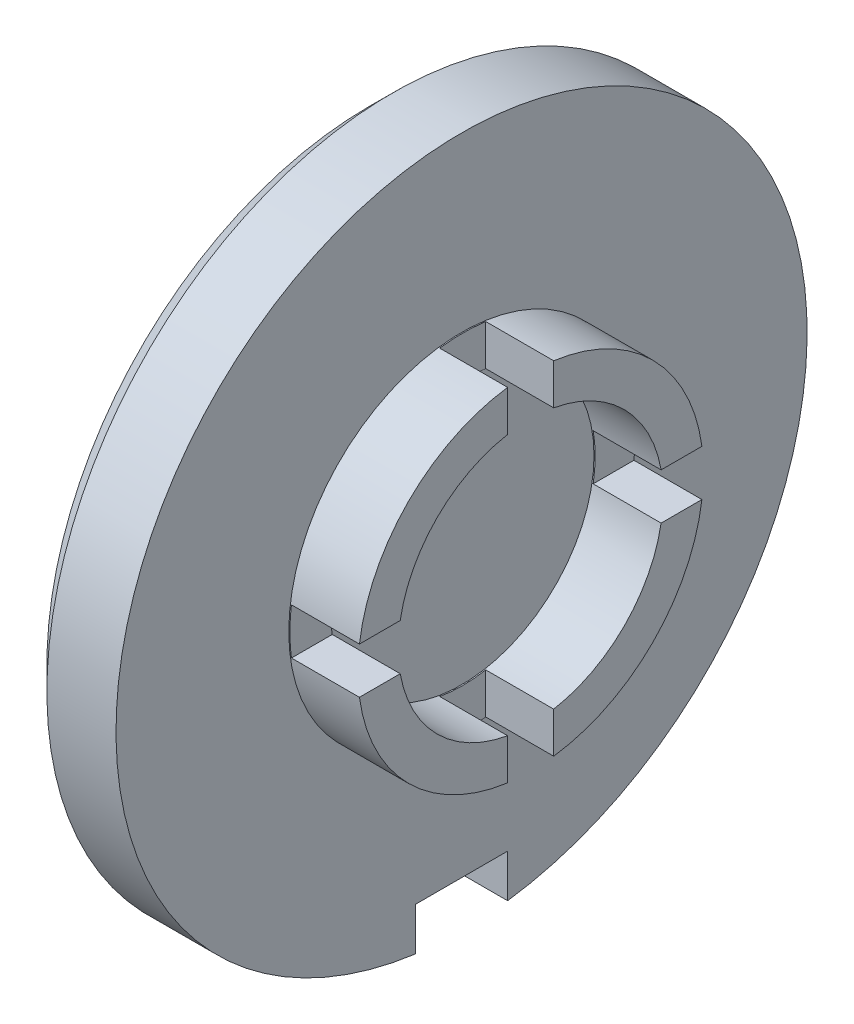
ISO-10303-21;
HEADER;
FILE_DESCRIPTION(('STEP AP214'),'2;1');
FILE_NAME('part.step','',(''),(''),'','','');
FILE_SCHEMA(('AUTOMOTIVE_DESIGN { 1 0 10303 214 1 1 1 1 }'));
ENDSEC;
DATA;
#1=APPLICATION_CONTEXT('core data for automotive mechanical design processes');
#2=APPLICATION_PROTOCOL_DEFINITION('international standard','automotive_design',2000,#1);
#3=PRODUCT_CONTEXT('',#1,'mechanical');
#4=PRODUCT('Part','Part','',(#3));
#5=PRODUCT_RELATED_PRODUCT_CATEGORY('part','',(#4));
#6=PRODUCT_DEFINITION_FORMATION('','',#4);
#7=PRODUCT_DEFINITION_CONTEXT('part definition',#1,'design');
#8=PRODUCT_DEFINITION('design','',#6,#7);
#9=PRODUCT_DEFINITION_SHAPE('','',#8);
#10=(LENGTH_UNIT() NAMED_UNIT(*) SI_UNIT(.MILLI.,.METRE.));
#11=(NAMED_UNIT(*) PLANE_ANGLE_UNIT() SI_UNIT($,.RADIAN.));
#12=(NAMED_UNIT(*) SI_UNIT($,.STERADIAN.) SOLID_ANGLE_UNIT());
#13=UNCERTAINTY_MEASURE_WITH_UNIT(LENGTH_MEASURE(1.E-05),#10,'distance_accuracy_value','');
#14=(GEOMETRIC_REPRESENTATION_CONTEXT(3) GLOBAL_UNCERTAINTY_ASSIGNED_CONTEXT((#13)) GLOBAL_UNIT_ASSIGNED_CONTEXT((#10,
#11,#12)) REPRESENTATION_CONTEXT('',''));
#15=CARTESIAN_POINT('',(0.,0.,0.));
#16=DIRECTION('',(0.,0.,1.));
#17=DIRECTION('',(1.,0.,0.));
#18=AXIS2_PLACEMENT_3D('',#15,#16,#17);
#19=CARTESIAN_POINT('',(-76.8,-20.,-52.));
#20=DIRECTION('',(1.,0.,0.));
#21=DIRECTION('',(0.,0.,-1.));
#22=AXIS2_PLACEMENT_3D('',#19,#20,#21);
#23=PLANE('',#22);
#24=DIRECTION('',(0.,1.,0.));
#25=VECTOR('',#24,1.);
#26=CARTESIAN_POINT('',(-76.8,-20.,-51.2));
#27=LINE('',#26,#25);
#28=CARTESIAN_POINT('',(-76.8,-25.5425625842204,-51.2));
#29=VERTEX_POINT('',#28);
#30=CARTESIAN_POINT('',(-76.8,-25.2,-51.2));
#31=VERTEX_POINT('',#30);
#32=EDGE_CURVE('E359',#29,#31,#27,.T.);
#33=ORIENTED_EDGE('',*,*,#32,.F.);
#34=CARTESIAN_POINT('',(-76.8,-20.,-52.));
#35=DIRECTION('',(-1.,0.,0.));
#36=DIRECTION('',(0.,0.,1.));
#37=AXIS2_PLACEMENT_3D('',#34,#35,#36);
#38=CIRCLE('',#37,5.6);
#39=CARTESIAN_POINT('',(-76.8,-25.5425625842204,-52.8));
#40=VERTEX_POINT('',#39);
#41=EDGE_CURVE('E260',#29,#40,#38,.T.);
#42=ORIENTED_EDGE('',*,*,#41,.T.);
#43=DIRECTION('',(0.,1.,0.));
#44=VECTOR('',#43,1.);
#45=CARTESIAN_POINT('',(-76.8,-20.,-52.8));
#46=LINE('',#45,#44);
#47=CARTESIAN_POINT('',(-76.8,-25.2,-52.8));
#48=VERTEX_POINT('',#47);
#49=EDGE_CURVE('E395',#40,#48,#46,.T.);
#50=ORIENTED_EDGE('',*,*,#49,.T.);
#51=DIRECTION('',(0.,0.,-1.));
#52=VECTOR('',#51,1.);
#53=CARTESIAN_POINT('',(-76.8,-25.2,-52.));
#54=LINE('',#53,#52);
#55=EDGE_CURVE('E205',#31,#48,#54,.T.);
#56=ORIENTED_EDGE('',*,*,#55,.F.);
#57=EDGE_LOOP('',(#33,#42,#50,#56));
#58=FACE_BOUND('',#57,.T.);
#59=ADVANCED_FACE('F47',(#58),#23,.F.);
#60=CARTESIAN_POINT('',(-76.4,-20.,-52.));
#61=DIRECTION('',(1.,0.,0.));
#62=DIRECTION('',(0.,0.,-1.));
#63=AXIS2_PLACEMENT_3D('',#60,#61,#62);
#64=CONICAL_SURFACE('',#63,6.,0.78539816339747);
#65=CARTESIAN_POINT('',(-75.5053728090001,-26.8480569582091,-51.2));
#66=CARTESIAN_POINT('',(-75.6881030317566,-26.6640807466869,-51.2));
#67=CARTESIAN_POINT('',(-75.8707866928955,-26.480058250433,-51.2));
#68=CARTESIAN_POINT('',(-76.2360245862569,-26.1118852017641,-51.2));
#69=CARTESIAN_POINT('',(-76.418578818597,-25.9277346494659,-51.2));
#70=CARTESIAN_POINT('',(-76.7835219670777,-25.5592695807787,-51.2));
#71=CARTESIAN_POINT('',(-76.9659108831408,-25.374955064313,-51.2));
#72=CARTESIAN_POINT('',(-77.3304582431577,-25.0060979425621,-51.2));
#73=CARTESIAN_POINT('',(-77.5126166868986,-24.8215553370668,-51.2));
#74=CARTESIAN_POINT('',(-77.6946271909999,-24.6368667515551,-51.2));
#75=B_SPLINE_CURVE_WITH_KNOTS('',3,(#65,#66,#67,#68,#69,#70,#71,#72,#73,#74),.UNSPECIFIED.,.F.,
.F.,(4,2,2,2,4),(0.,0.777906337908829,1.55581196755155,2.33371796179654,3.11162467374078),.UNSPECIFIED.);
#76=CARTESIAN_POINT('',(-76.4,-25.9464274989274,-51.2));
#77=VERTEX_POINT('',#76);
#78=EDGE_CURVE('E362',#77,#29,#75,.T.);
#79=ORIENTED_EDGE('',*,*,#78,.F.);
#80=CARTESIAN_POINT('',(-76.4,-20.,-52.));
#81=DIRECTION('',(-1.,0.,0.));
#82=DIRECTION('',(0.,0.,1.));
#83=AXIS2_PLACEMENT_3D('',#80,#81,#82);
#84=CIRCLE('',#83,6.);
#85=CARTESIAN_POINT('',(-76.4,-25.9464274989274,-52.8));
#86=VERTEX_POINT('',#85);
#87=EDGE_CURVE('E264',#77,#86,#84,.T.);
#88=ORIENTED_EDGE('',*,*,#87,.T.);
#89=CARTESIAN_POINT('',(-75.5053728090001,-26.8480569582091,-52.8));
#90=CARTESIAN_POINT('',(-75.6881030317566,-26.6640807466869,-52.8));
#91=CARTESIAN_POINT('',(-75.8707866928955,-26.480058250433,-52.8));
#92=CARTESIAN_POINT('',(-76.2360245862569,-26.1118852017641,-52.8));
#93=CARTESIAN_POINT('',(-76.418578818597,-25.9277346494659,-52.8));
#94=CARTESIAN_POINT('',(-76.7835219670777,-25.5592695807787,-52.8));
#95=CARTESIAN_POINT('',(-76.9659108831408,-25.374955064313,-52.8));
#96=CARTESIAN_POINT('',(-77.3304582431577,-25.0060979425621,-52.8));
#97=CARTESIAN_POINT('',(-77.5126166868986,-24.8215553370668,-52.8));
#98=CARTESIAN_POINT('',(-77.6946271909999,-24.6368667515551,-52.8));
#99=B_SPLINE_CURVE_WITH_KNOTS('',3,(#89,#90,#91,#92,#93,#94,#95,#96,#97,#98),.UNSPECIFIED.,.F.,
.F.,(4,2,2,2,4),(0.,0.777906337908829,1.55581196755155,2.33371796179654,3.11162467374078),.UNSPECIFIED.);
#100=EDGE_CURVE('E387',#86,#40,#99,.T.);
#101=ORIENTED_EDGE('',*,*,#100,.T.);
#102=ORIENTED_EDGE('',*,*,#41,.F.);
#103=EDGE_LOOP('',(#79,#88,#101,#102));
#104=FACE_BOUND('',#103,.T.);
#105=ADVANCED_FACE('F373',(#104),#64,.T.);
#106=CARTESIAN_POINT('',(-81.8,-20.,-52.));
#107=DIRECTION('',(-1.,0.,0.));
#108=DIRECTION('',(0.,0.,1.));
#109=AXIS2_PLACEMENT_3D('',#106,#107,#108);
#110=CYLINDRICAL_SURFACE('',#109,6.);
#111=DIRECTION('',(-1.,0.,0.));
#112=VECTOR('',#111,1.);
#113=CARTESIAN_POINT('',(-81.8,-25.9464274989274,-51.2));
#114=LINE('',#113,#112);
#115=CARTESIAN_POINT('',(-75.2,-25.9464274989274,-51.2));
#116=VERTEX_POINT('',#115);
#117=EDGE_CURVE('E371',#116,#77,#114,.T.);
#118=ORIENTED_EDGE('',*,*,#117,.F.);
#119=CARTESIAN_POINT('',(-75.2,-20.,-52.));
#120=DIRECTION('',(-1.,0.,0.));
#121=DIRECTION('',(0.,0.,1.));
#122=AXIS2_PLACEMENT_3D('',#119,#120,#121);
#123=CIRCLE('',#122,6.);
#124=CARTESIAN_POINT('',(-75.2,-25.9464274989274,-52.8));
#125=VERTEX_POINT('',#124);
#126=EDGE_CURVE('E268',#116,#125,#123,.T.);
#127=ORIENTED_EDGE('',*,*,#126,.T.);
#128=DIRECTION('',(-1.,0.,0.));
#129=VECTOR('',#128,1.);
#130=CARTESIAN_POINT('',(-81.8,-25.9464274989274,-52.8));
#131=LINE('',#130,#129);
#132=EDGE_CURVE('E63',#125,#86,#131,.T.);
#133=ORIENTED_EDGE('',*,*,#132,.T.);
#134=ORIENTED_EDGE('',*,*,#87,.F.);
#135=EDGE_LOOP('',(#118,#127,#133,#134));
#136=FACE_BOUND('',#135,.T.);
#137=ADVANCED_FACE('F406',(#136),#110,.T.);
#138=CARTESIAN_POINT('',(-75.2,-14.,-52.));
#139=DIRECTION('',(-1.,0.,0.));
#140=DIRECTION('',(0.,0.,1.));
#141=AXIS2_PLACEMENT_3D('',#138,#139,#140);
#142=PLANE('',#141);
#143=CARTESIAN_POINT('',(-75.2,-20.,-52.));
#144=DIRECTION('',(-1.,0.,0.));
#145=DIRECTION('',(0.,0.,1.));
#146=AXIS2_PLACEMENT_3D('',#143,#144,#145);
#147=CIRCLE('',#146,3.);
#148=CARTESIAN_POINT('',(-75.2,-20.,-49.));
#149=VERTEX_POINT('',#148);
#150=EDGE_CURVE('E271',#149,#149,#147,.T.);
#151=ORIENTED_EDGE('',*,*,#150,.T.);
#152=EDGE_LOOP('',(#151));
#153=FACE_BOUND('',#152,.T.);
#154=DIRECTION('',(0.,-1.,0.));
#155=VECTOR('',#154,1.);
#156=CARTESIAN_POINT('',(-75.2,-14.,-51.2));
#157=LINE('',#156,#155);
#158=CARTESIAN_POINT('',(-75.2,-25.2,-51.2));
#159=VERTEX_POINT('',#158);
#160=EDGE_CURVE('E11',#159,#116,#157,.T.);
#161=ORIENTED_EDGE('',*,*,#160,.F.);
#162=DIRECTION('',(0.,0.,1.));
#163=VECTOR('',#162,1.);
#164=CARTESIAN_POINT('',(-75.2,-25.2,-52.));
#165=LINE('',#164,#163);
#166=CARTESIAN_POINT('',(-75.2,-25.2,-52.8));
#167=VERTEX_POINT('',#166);
#168=EDGE_CURVE('E56',#167,#159,#165,.T.);
#169=ORIENTED_EDGE('',*,*,#168,.F.);
#170=DIRECTION('',(0.,-1.,0.));
#171=VECTOR('',#170,1.);
#172=CARTESIAN_POINT('',(-75.2,-14.,-52.8));
#173=LINE('',#172,#171);
#174=EDGE_CURVE('E188',#167,#125,#173,.T.);
#175=ORIENTED_EDGE('',*,*,#174,.T.);
#176=ORIENTED_EDGE('',*,*,#126,.F.);
#177=EDGE_LOOP('',(#161,#169,#175,#176));
#178=FACE_BOUND('',#177,.T.);
#179=ADVANCED_FACE('F210',(#153,#178),#142,.F.);
#180=CARTESIAN_POINT('',(-74.,-17.,-52.));
#181=DIRECTION('',(-1.,0.,0.));
#182=DIRECTION('',(0.,0.,1.));
#183=AXIS2_PLACEMENT_3D('',#180,#181,#182);
#184=PLANE('',#183);
#185=DIRECTION('',(0.,-1.,0.));
#186=VECTOR('',#185,1.);
#187=CARTESIAN_POINT('',(-74.,-17.,-51.6));
#188=LINE('',#187,#186);
#189=CARTESIAN_POINT('',(-74.,-22.2649503305812,-51.6));
#190=VERTEX_POINT('',#189);
#191=CARTESIAN_POINT('',(-74.,-22.9732137494637,-51.6));
#192=VERTEX_POINT('',#191);
#193=EDGE_CURVE('E324',#190,#192,#188,.T.);
#194=ORIENTED_EDGE('',*,*,#193,.F.);
#195=CARTESIAN_POINT('',(-74.,-20.,-52.));
#196=DIRECTION('',(-1.,0.,0.));
#197=DIRECTION('',(0.,0.,1.));
#198=AXIS2_PLACEMENT_3D('',#195,#196,#197);
#199=CIRCLE('',#198,2.3);
#200=CARTESIAN_POINT('',(-74.,-20.4,-49.7350496694188));
#201=VERTEX_POINT('',#200);
#202=EDGE_CURVE('E259',#190,#201,#199,.T.);
#203=ORIENTED_EDGE('',*,*,#202,.T.);
#204=DIRECTION('',(0.,0.,-1.));
#205=VECTOR('',#204,1.);
#206=CARTESIAN_POINT('',(-74.,-20.4,-52.));
#207=LINE('',#206,#205);
#208=CARTESIAN_POINT('',(-74.,-20.4,-49.0267862505363));
#209=VERTEX_POINT('',#208);
#210=EDGE_CURVE('E293',#209,#201,#207,.T.);
#211=ORIENTED_EDGE('',*,*,#210,.F.);
#212=CARTESIAN_POINT('',(-74.,-20.,-52.));
#213=DIRECTION('',(-1.,0.,0.));
#214=DIRECTION('',(0.,0.,1.));
#215=AXIS2_PLACEMENT_3D('',#212,#213,#214);
#216=CIRCLE('',#215,3.);
#217=EDGE_CURVE('E280',#192,#209,#216,.T.);
#218=ORIENTED_EDGE('',*,*,#217,.F.);
#219=EDGE_LOOP('',(#194,#203,#211,#218));
#220=FACE_BOUND('',#219,.T.);
#221=ADVANCED_FACE('F431',(#220),#184,.F.);
#222=DIRECTION('',(0.,-1.,0.));
#223=VECTOR('',#222,1.);
#224=CARTESIAN_POINT('',(-74.,-17.,-51.6));
#225=LINE('',#224,#223);
#226=CARTESIAN_POINT('',(-74.,-17.0267862505363,-51.6));
#227=VERTEX_POINT('',#226);
#228=CARTESIAN_POINT('',(-74.,-17.7350496694188,-51.6));
#229=VERTEX_POINT('',#228);
#230=EDGE_CURVE('E330',#227,#229,#225,.T.);
#231=ORIENTED_EDGE('',*,*,#230,.F.);
#232=CARTESIAN_POINT('',(-74.,-19.6,-49.0267862505363));
#233=VERTEX_POINT('',#232);
#234=EDGE_CURVE('E275',#233,#227,#216,.T.);
#235=ORIENTED_EDGE('',*,*,#234,.F.);
#236=DIRECTION('',(0.,0.,1.));
#237=VECTOR('',#236,1.);
#238=CARTESIAN_POINT('',(-74.,-19.6,-52.));
#239=LINE('',#238,#237);
#240=CARTESIAN_POINT('',(-74.,-19.6,-49.7350496694188));
#241=VERTEX_POINT('',#240);
#242=EDGE_CURVE('E300',#241,#233,#239,.T.);
#243=ORIENTED_EDGE('',*,*,#242,.F.);
#244=EDGE_CURVE('E249',#241,#229,#199,.T.);
#245=ORIENTED_EDGE('',*,*,#244,.T.);
#246=EDGE_LOOP('',(#231,#235,#243,#245));
#247=FACE_BOUND('',#246,.T.);
#248=ADVANCED_FACE('F423',(#247),#184,.F.);
#249=CARTESIAN_POINT('',(-81.8,-20.,-52.));
#250=DIRECTION('',(-1.,0.,0.));
#251=DIRECTION('',(0.,0.,1.));
#252=AXIS2_PLACEMENT_3D('',#249,#250,#251);
#253=CYLINDRICAL_SURFACE('',#252,2.3);
#254=CARTESIAN_POINT('',(-75.2,-20.,-52.));
#255=DIRECTION('',(-1.,0.,0.));
#256=DIRECTION('',(0.,0.,1.));
#257=AXIS2_PLACEMENT_3D('',#254,#255,#256);
#258=CIRCLE('',#257,2.3);
#259=CARTESIAN_POINT('',(-75.2,-20.,-49.7));
#260=VERTEX_POINT('',#259);
#261=EDGE_CURVE('E255',#260,#260,#258,.T.);
#262=ORIENTED_EDGE('',*,*,#261,.T.);
#263=EDGE_LOOP('',(#262));
#264=FACE_BOUND('',#263,.T.);
#265=DIRECTION('',(-1.,0.,0.));
#266=VECTOR('',#265,1.);
#267=CARTESIAN_POINT('',(-81.8,-22.2649503305812,-51.6));
#268=LINE('',#267,#266);
#269=CARTESIAN_POINT('',(-75.18,-22.2649503305812,-51.6));
#270=VERTEX_POINT('',#269);
#271=EDGE_CURVE('E321',#270,#190,#268,.F.);
#272=ORIENTED_EDGE('',*,*,#271,.F.);
#273=CARTESIAN_POINT('',(-75.18,-20.,-52.));
#274=DIRECTION('',(1.,0.,0.));
#275=DIRECTION('',(0.,0.,-1.));
#276=AXIS2_PLACEMENT_3D('',#273,#274,#275);
#277=CIRCLE('',#276,2.3);
#278=CARTESIAN_POINT('',(-75.18,-22.2649503305812,-52.4));
#279=VERTEX_POINT('',#278);
#280=EDGE_CURVE('E317',#279,#270,#277,.F.);
#281=ORIENTED_EDGE('',*,*,#280,.F.);
#282=DIRECTION('',(-1.,0.,0.));
#283=VECTOR('',#282,1.);
#284=CARTESIAN_POINT('',(-81.8,-22.2649503305812,-52.4));
#285=LINE('',#284,#283);
#286=CARTESIAN_POINT('',(-74.,-22.2649503305812,-52.4));
#287=VERTEX_POINT('',#286);
#288=EDGE_CURVE('E333',#279,#287,#285,.F.);
#289=ORIENTED_EDGE('',*,*,#288,.T.);
#290=CARTESIAN_POINT('',(-74.,-20.4,-54.2649503305812));
#291=VERTEX_POINT('',#290);
#292=EDGE_CURVE('E254',#291,#287,#199,.T.);
#293=ORIENTED_EDGE('',*,*,#292,.F.);
#294=DIRECTION('',(-1.,0.,0.));
#295=VECTOR('',#294,1.);
#296=CARTESIAN_POINT('',(-81.8,-20.4,-54.2649503305812));
#297=LINE('',#296,#295);
#298=CARTESIAN_POINT('',(-75.18,-20.4,-54.2649503305812));
#299=VERTEX_POINT('',#298);
#300=EDGE_CURVE('E286',#299,#291,#297,.F.);
#301=ORIENTED_EDGE('',*,*,#300,.F.);
#302=CARTESIAN_POINT('',(-75.18,-20.,-52.));
#303=DIRECTION('',(1.,0.,0.));
#304=DIRECTION('',(0.,0.,-1.));
#305=AXIS2_PLACEMENT_3D('',#302,#303,#304);
#306=CIRCLE('',#305,2.3);
#307=CARTESIAN_POINT('',(-75.18,-19.6,-54.2649503305812));
#308=VERTEX_POINT('',#307);
#309=EDGE_CURVE('E282',#308,#299,#306,.F.);
#310=ORIENTED_EDGE('',*,*,#309,.F.);
#311=DIRECTION('',(-1.,0.,0.));
#312=VECTOR('',#311,1.);
#313=CARTESIAN_POINT('',(-81.8,-19.6,-54.2649503305812));
#314=LINE('',#313,#312);
#315=CARTESIAN_POINT('',(-74.,-19.6,-54.2649503305812));
#316=VERTEX_POINT('',#315);
#317=EDGE_CURVE('E301',#316,#308,#314,.T.);
#318=ORIENTED_EDGE('',*,*,#317,.F.);
#319=CARTESIAN_POINT('',(-74.,-17.7350496694188,-52.4));
#320=VERTEX_POINT('',#319);
#321=EDGE_CURVE('E253',#320,#316,#199,.T.);
#322=ORIENTED_EDGE('',*,*,#321,.F.);
#323=DIRECTION('',(-1.,0.,0.));
#324=VECTOR('',#323,1.);
#325=CARTESIAN_POINT('',(-81.8,-17.7350496694188,-52.4));
#326=LINE('',#325,#324);
#327=CARTESIAN_POINT('',(-75.18,-17.7350496694188,-52.4));
#328=VERTEX_POINT('',#327);
#329=EDGE_CURVE('E341',#320,#328,#326,.T.);
#330=ORIENTED_EDGE('',*,*,#329,.T.);
#331=CARTESIAN_POINT('',(-75.18,-17.7350496694188,-51.6));
#332=VERTEX_POINT('',#331);
#333=EDGE_CURVE('E318',#332,#328,#277,.F.);
#334=ORIENTED_EDGE('',*,*,#333,.F.);
#335=DIRECTION('',(-1.,0.,0.));
#336=VECTOR('',#335,1.);
#337=CARTESIAN_POINT('',(-81.8,-17.7350496694188,-51.6));
#338=LINE('',#337,#336);
#339=EDGE_CURVE('E327',#229,#332,#338,.T.);
#340=ORIENTED_EDGE('',*,*,#339,.F.);
#341=ORIENTED_EDGE('',*,*,#244,.F.);
#342=DIRECTION('',(-1.,0.,0.));
#343=VECTOR('',#342,1.);
#344=CARTESIAN_POINT('',(-81.8,-19.6,-49.7350496694188));
#345=LINE('',#344,#343);
#346=CARTESIAN_POINT('',(-75.18,-19.6,-49.7350496694188));
#347=VERTEX_POINT('',#346);
#348=EDGE_CURVE('E297',#347,#241,#345,.F.);
#349=ORIENTED_EDGE('',*,*,#348,.F.);
#350=CARTESIAN_POINT('',(-75.18,-20.4,-49.7350496694188));
#351=VERTEX_POINT('',#350);
#352=EDGE_CURVE('E285',#351,#347,#306,.F.);
#353=ORIENTED_EDGE('',*,*,#352,.F.);
#354=DIRECTION('',(-1.,0.,0.));
#355=VECTOR('',#354,1.);
#356=CARTESIAN_POINT('',(-81.8,-20.4,-49.7350496694188));
#357=LINE('',#356,#355);
#358=EDGE_CURVE('E290',#201,#351,#357,.T.);
#359=ORIENTED_EDGE('',*,*,#358,.F.);
#360=ORIENTED_EDGE('',*,*,#202,.F.);
#361=EDGE_LOOP('',(#272,#281,#289,#293,#301,#310,#318,#322,#330,#334,#340,#341,#349,#353,#359,#360));
#362=FACE_BOUND('',#361,.T.);
#363=ADVANCED_FACE('F420',(#264,#362),#253,.F.);
#364=CARTESIAN_POINT('',(-81.8,-20.,-52.));
#365=DIRECTION('',(-1.,0.,0.));
#366=DIRECTION('',(0.,0.,1.));
#367=AXIS2_PLACEMENT_3D('',#364,#365,#366);
#368=CYLINDRICAL_SURFACE('',#367,3.);
#369=ORIENTED_EDGE('',*,*,#150,.F.);
#370=EDGE_LOOP('',(#369));
#371=FACE_BOUND('',#370,.T.);
#372=DIRECTION('',(-1.,0.,0.));
#373=VECTOR('',#372,1.);
#374=CARTESIAN_POINT('',(-81.8,-22.9732137494637,-51.6));
#375=LINE('',#374,#373);
#376=CARTESIAN_POINT('',(-75.18,-22.9732137494637,-51.6));
#377=VERTEX_POINT('',#376);
#378=EDGE_CURVE('E198',#192,#377,#375,.T.);
#379=ORIENTED_EDGE('',*,*,#378,.F.);
#380=ORIENTED_EDGE('',*,*,#217,.T.);
#381=DIRECTION('',(-1.,0.,0.));
#382=VECTOR('',#381,1.);
#383=CARTESIAN_POINT('',(-81.8,-20.4,-49.0267862505363));
#384=LINE('',#383,#382);
#385=CARTESIAN_POINT('',(-75.18,-20.4,-49.0267862505363));
#386=VERTEX_POINT('',#385);
#387=EDGE_CURVE('E230',#386,#209,#384,.F.);
#388=ORIENTED_EDGE('',*,*,#387,.F.);
#389=CARTESIAN_POINT('',(-75.18,-20.,-52.));
#390=DIRECTION('',(1.,0.,0.));
#391=DIRECTION('',(0.,0.,-1.));
#392=AXIS2_PLACEMENT_3D('',#389,#390,#391);
#393=CIRCLE('',#392,3.);
#394=CARTESIAN_POINT('',(-75.18,-19.6,-49.0267862505363));
#395=VERTEX_POINT('',#394);
#396=EDGE_CURVE('E234',#395,#386,#393,.T.);
#397=ORIENTED_EDGE('',*,*,#396,.F.);
#398=DIRECTION('',(-1.,0.,0.));
#399=VECTOR('',#398,1.);
#400=CARTESIAN_POINT('',(-81.8,-19.6,-49.0267862505363));
#401=LINE('',#400,#399);
#402=EDGE_CURVE('E235',#233,#395,#401,.T.);
#403=ORIENTED_EDGE('',*,*,#402,.F.);
#404=ORIENTED_EDGE('',*,*,#234,.T.);
#405=DIRECTION('',(-1.,0.,0.));
#406=VECTOR('',#405,1.);
#407=CARTESIAN_POINT('',(-81.8,-17.0267862505363,-51.6));
#408=LINE('',#407,#406);
#409=CARTESIAN_POINT('',(-75.18,-17.0267862505363,-51.6));
#410=VERTEX_POINT('',#409);
#411=EDGE_CURVE('E220',#410,#227,#408,.F.);
#412=ORIENTED_EDGE('',*,*,#411,.F.);
#413=CARTESIAN_POINT('',(-75.18,-20.,-52.));
#414=DIRECTION('',(1.,0.,0.));
#415=DIRECTION('',(0.,0.,-1.));
#416=AXIS2_PLACEMENT_3D('',#413,#414,#415);
#417=CIRCLE('',#416,3.);
#418=CARTESIAN_POINT('',(-75.18,-17.0267862505363,-52.4));
#419=VERTEX_POINT('',#418);
#420=EDGE_CURVE('E223',#419,#410,#417,.T.);
#421=ORIENTED_EDGE('',*,*,#420,.F.);
#422=DIRECTION('',(-1.,0.,0.));
#423=VECTOR('',#422,1.);
#424=CARTESIAN_POINT('',(-81.8,-17.0267862505363,-52.4));
#425=LINE('',#424,#423);
#426=CARTESIAN_POINT('',(-74.,-17.0267862505363,-52.4));
#427=VERTEX_POINT('',#426);
#428=EDGE_CURVE('E226',#419,#427,#425,.F.);
#429=ORIENTED_EDGE('',*,*,#428,.T.);
#430=CARTESIAN_POINT('',(-74.,-19.6,-54.9732137494637));
#431=VERTEX_POINT('',#430);
#432=EDGE_CURVE('E279',#427,#431,#216,.T.);
#433=ORIENTED_EDGE('',*,*,#432,.T.);
#434=DIRECTION('',(-1.,0.,0.));
#435=VECTOR('',#434,1.);
#436=CARTESIAN_POINT('',(-81.8,-19.6,-54.9732137494637));
#437=LINE('',#436,#435);
#438=CARTESIAN_POINT('',(-75.18,-19.6,-54.9732137494637));
#439=VERTEX_POINT('',#438);
#440=EDGE_CURVE('E245',#439,#431,#437,.F.);
#441=ORIENTED_EDGE('',*,*,#440,.F.);
#442=CARTESIAN_POINT('',(-75.18,-20.4,-54.9732137494637));
#443=VERTEX_POINT('',#442);
#444=EDGE_CURVE('E241',#443,#439,#393,.T.);
#445=ORIENTED_EDGE('',*,*,#444,.F.);
#446=DIRECTION('',(-1.,0.,0.));
#447=VECTOR('',#446,1.);
#448=CARTESIAN_POINT('',(-81.8,-20.4,-54.9732137494637));
#449=LINE('',#448,#447);
#450=CARTESIAN_POINT('',(-74.,-20.4,-54.9732137494637));
#451=VERTEX_POINT('',#450);
#452=EDGE_CURVE('E238',#451,#443,#449,.T.);
#453=ORIENTED_EDGE('',*,*,#452,.F.);
#454=CARTESIAN_POINT('',(-74.,-22.9732137494637,-52.4));
#455=VERTEX_POINT('',#454);
#456=EDGE_CURVE('E281',#451,#455,#216,.T.);
#457=ORIENTED_EDGE('',*,*,#456,.T.);
#458=DIRECTION('',(-1.,0.,0.));
#459=VECTOR('',#458,1.);
#460=CARTESIAN_POINT('',(-81.8,-22.9732137494637,-52.4));
#461=LINE('',#460,#459);
#462=CARTESIAN_POINT('',(-75.18,-22.9732137494637,-52.4));
#463=VERTEX_POINT('',#462);
#464=EDGE_CURVE('E216',#455,#463,#461,.T.);
#465=ORIENTED_EDGE('',*,*,#464,.T.);
#466=EDGE_CURVE('E215',#377,#463,#417,.T.);
#467=ORIENTED_EDGE('',*,*,#466,.F.);
#468=EDGE_LOOP('',(#379,#380,#388,#397,#403,#404,#412,#421,#429,#433,#441,#445,#453,#457,#465,#467));
#469=FACE_BOUND('',#468,.T.);
#470=ADVANCED_FACE('F422',(#371,#469),#368,.T.);
#471=ORIENTED_EDGE('',*,*,#292,.T.);
#472=DIRECTION('',(0.,-1.,0.));
#473=VECTOR('',#472,1.);
#474=CARTESIAN_POINT('',(-74.,-17.,-52.4));
#475=LINE('',#474,#473);
#476=EDGE_CURVE('E337',#287,#455,#475,.T.);
#477=ORIENTED_EDGE('',*,*,#476,.T.);
#478=ORIENTED_EDGE('',*,*,#456,.F.);
#479=EDGE_CURVE('E289',#291,#451,#207,.T.);
#480=ORIENTED_EDGE('',*,*,#479,.F.);
#481=EDGE_LOOP('',(#471,#477,#478,#480));
#482=FACE_BOUND('',#481,.T.);
#483=ADVANCED_FACE('F49',(#482),#184,.F.);
#484=ORIENTED_EDGE('',*,*,#432,.F.);
#485=DIRECTION('',(0.,-1.,0.));
#486=VECTOR('',#485,1.);
#487=CARTESIAN_POINT('',(-74.,-17.,-52.4));
#488=LINE('',#487,#486);
#489=EDGE_CURVE('E345',#427,#320,#488,.T.);
#490=ORIENTED_EDGE('',*,*,#489,.T.);
#491=ORIENTED_EDGE('',*,*,#321,.T.);
#492=EDGE_CURVE('E304',#431,#316,#239,.T.);
#493=ORIENTED_EDGE('',*,*,#492,.F.);
#494=EDGE_LOOP('',(#484,#490,#491,#493));
#495=FACE_BOUND('',#494,.T.);
#496=ADVANCED_FACE('F418',(#495),#184,.F.);
#497=CARTESIAN_POINT('',(-75.2,-17.7,-52.));
#498=DIRECTION('',(-1.,0.,0.));
#499=DIRECTION('',(0.,0.,1.));
#500=AXIS2_PLACEMENT_3D('',#497,#498,#499);
#501=PLANE('',#500);
#502=ORIENTED_EDGE('',*,*,#261,.F.);
#503=EDGE_LOOP('',(#502));
#504=FACE_BOUND('',#503,.T.);
#505=ADVANCED_FACE('F415',(#504),#501,.F.);
#506=CARTESIAN_POINT('',(-75.18,-20.4,-48.8));
#507=DIRECTION('',(0.,1.,0.));
#508=DIRECTION('',(0.,0.,1.));
#509=AXIS2_PLACEMENT_3D('',#506,#507,#508);
#510=PLANE('',#509);
#511=ORIENTED_EDGE('',*,*,#300,.T.);
#512=ORIENTED_EDGE('',*,*,#479,.T.);
#513=ORIENTED_EDGE('',*,*,#452,.T.);
#514=DIRECTION('',(0.,0.,-1.));
#515=VECTOR('',#514,1.);
#516=CARTESIAN_POINT('',(-75.18,-20.4,-48.8));
#517=LINE('',#516,#515);
#518=EDGE_CURVE('E309',#299,#443,#517,.T.);
#519=ORIENTED_EDGE('',*,*,#518,.F.);
#520=EDGE_LOOP('',(#511,#512,#513,#519));
#521=FACE_BOUND('',#520,.T.);
#522=ADVANCED_FACE('F417',(#521),#510,.T.);
#523=CARTESIAN_POINT('',(-75.18,-19.6,-48.8));
#524=DIRECTION('',(0.,-1.,0.));
#525=DIRECTION('',(0.,0.,-1.));
#526=AXIS2_PLACEMENT_3D('',#523,#524,#525);
#527=PLANE('',#526);
#528=ORIENTED_EDGE('',*,*,#317,.T.);
#529=DIRECTION('',(0.,0.,-1.));
#530=VECTOR('',#529,1.);
#531=CARTESIAN_POINT('',(-75.18,-19.6,-48.8));
#532=LINE('',#531,#530);
#533=EDGE_CURVE('E314',#308,#439,#532,.T.);
#534=ORIENTED_EDGE('',*,*,#533,.T.);
#535=ORIENTED_EDGE('',*,*,#440,.T.);
#536=ORIENTED_EDGE('',*,*,#492,.T.);
#537=EDGE_LOOP('',(#528,#534,#535,#536));
#538=FACE_BOUND('',#537,.T.);
#539=ADVANCED_FACE('F461',(#538),#527,.T.);
#540=CARTESIAN_POINT('',(-75.18,-20.4,-48.8));
#541=DIRECTION('',(1.,0.,0.));
#542=DIRECTION('',(0.,0.,-1.));
#543=AXIS2_PLACEMENT_3D('',#540,#541,#542);
#544=PLANE('',#543);
#545=ORIENTED_EDGE('',*,*,#309,.T.);
#546=ORIENTED_EDGE('',*,*,#518,.T.);
#547=ORIENTED_EDGE('',*,*,#444,.T.);
#548=ORIENTED_EDGE('',*,*,#533,.F.);
#549=EDGE_LOOP('',(#545,#546,#547,#548));
#550=FACE_BOUND('',#549,.T.);
#551=ADVANCED_FACE('F484',(#550),#544,.T.);
#552=ORIENTED_EDGE('',*,*,#352,.T.);
#553=EDGE_CURVE('E313',#395,#347,#532,.T.);
#554=ORIENTED_EDGE('',*,*,#553,.F.);
#555=ORIENTED_EDGE('',*,*,#396,.T.);
#556=EDGE_CURVE('E308',#386,#351,#517,.T.);
#557=ORIENTED_EDGE('',*,*,#556,.T.);
#558=EDGE_LOOP('',(#552,#554,#555,#557));
#559=FACE_BOUND('',#558,.T.);
#560=ADVANCED_FACE('F486',(#559),#544,.T.);
#561=ORIENTED_EDGE('',*,*,#358,.T.);
#562=ORIENTED_EDGE('',*,*,#556,.F.);
#563=ORIENTED_EDGE('',*,*,#387,.T.);
#564=ORIENTED_EDGE('',*,*,#210,.T.);
#565=EDGE_LOOP('',(#561,#562,#563,#564));
#566=FACE_BOUND('',#565,.T.);
#567=ADVANCED_FACE('F491',(#566),#510,.T.);
#568=ORIENTED_EDGE('',*,*,#348,.T.);
#569=ORIENTED_EDGE('',*,*,#242,.T.);
#570=ORIENTED_EDGE('',*,*,#402,.T.);
#571=ORIENTED_EDGE('',*,*,#553,.T.);
#572=EDGE_LOOP('',(#568,#569,#570,#571));
#573=FACE_BOUND('',#572,.T.);
#574=ADVANCED_FACE('F495',(#573),#527,.T.);
#575=CARTESIAN_POINT('',(0.,0.,-52.4));
#576=DIRECTION('',(0.,0.,-1.));
#577=DIRECTION('',(-1.,0.,0.));
#578=AXIS2_PLACEMENT_3D('',#575,#576,#577);
#579=PLANE('',#578);
#580=ORIENTED_EDGE('',*,*,#489,.F.);
#581=ORIENTED_EDGE('',*,*,#428,.F.);
#582=DIRECTION('',(0.,-1.,0.));
#583=VECTOR('',#582,1.);
#584=CARTESIAN_POINT('',(-75.18,-23.2,-52.4));
#585=LINE('',#584,#583);
#586=EDGE_CURVE('E352',#419,#328,#585,.T.);
#587=ORIENTED_EDGE('',*,*,#586,.T.);
#588=ORIENTED_EDGE('',*,*,#329,.F.);
#589=EDGE_LOOP('',(#580,#581,#587,#588));
#590=FACE_BOUND('',#589,.T.);
#591=ADVANCED_FACE('F573',(#590),#579,.F.);
#592=CARTESIAN_POINT('',(0.,0.,-51.6));
#593=DIRECTION('',(0.,0.,-1.));
#594=DIRECTION('',(-1.,0.,0.));
#595=AXIS2_PLACEMENT_3D('',#592,#593,#594);
#596=PLANE('',#595);
#597=ORIENTED_EDGE('',*,*,#339,.T.);
#598=DIRECTION('',(0.,-1.,0.));
#599=VECTOR('',#598,1.);
#600=CARTESIAN_POINT('',(-75.18,-23.2,-51.6));
#601=LINE('',#600,#599);
#602=EDGE_CURVE('E349',#410,#332,#601,.T.);
#603=ORIENTED_EDGE('',*,*,#602,.F.);
#604=ORIENTED_EDGE('',*,*,#411,.T.);
#605=ORIENTED_EDGE('',*,*,#230,.T.);
#606=EDGE_LOOP('',(#597,#603,#604,#605));
#607=FACE_BOUND('',#606,.T.);
#608=ADVANCED_FACE('F591',(#607),#596,.T.);
#609=CARTESIAN_POINT('',(-75.18,-23.2,-51.6));
#610=DIRECTION('',(1.,0.,0.));
#611=DIRECTION('',(0.,0.,-1.));
#612=AXIS2_PLACEMENT_3D('',#609,#610,#611);
#613=PLANE('',#612);
#614=ORIENTED_EDGE('',*,*,#333,.T.);
#615=ORIENTED_EDGE('',*,*,#586,.F.);
#616=ORIENTED_EDGE('',*,*,#420,.T.);
#617=ORIENTED_EDGE('',*,*,#602,.T.);
#618=EDGE_LOOP('',(#614,#615,#616,#617));
#619=FACE_BOUND('',#618,.T.);
#620=ADVANCED_FACE('F600',(#619),#613,.T.);
#621=ORIENTED_EDGE('',*,*,#280,.T.);
#622=EDGE_CURVE('E353',#270,#377,#601,.T.);
#623=ORIENTED_EDGE('',*,*,#622,.T.);
#624=ORIENTED_EDGE('',*,*,#466,.T.);
#625=EDGE_CURVE('E71',#279,#463,#585,.T.);
#626=ORIENTED_EDGE('',*,*,#625,.F.);
#627=EDGE_LOOP('',(#621,#623,#624,#626));
#628=FACE_BOUND('',#627,.T.);
#629=ADVANCED_FACE('F477',(#628),#613,.T.);
#630=ORIENTED_EDGE('',*,*,#271,.T.);
#631=ORIENTED_EDGE('',*,*,#193,.T.);
#632=ORIENTED_EDGE('',*,*,#378,.T.);
#633=ORIENTED_EDGE('',*,*,#622,.F.);
#634=EDGE_LOOP('',(#630,#631,#632,#633));
#635=FACE_BOUND('',#634,.T.);
#636=ADVANCED_FACE('F442',(#635),#596,.T.);
#637=ORIENTED_EDGE('',*,*,#625,.T.);
#638=ORIENTED_EDGE('',*,*,#464,.F.);
#639=ORIENTED_EDGE('',*,*,#476,.F.);
#640=ORIENTED_EDGE('',*,*,#288,.F.);
#641=EDGE_LOOP('',(#637,#638,#639,#640));
#642=FACE_BOUND('',#641,.T.);
#643=ADVANCED_FACE('F475',(#642),#579,.F.);
#644=CARTESIAN_POINT('',(-76.9,-25.2,-51.2));
#645=DIRECTION('',(0.,-1.,0.));
#646=DIRECTION('',(0.,0.,-1.));
#647=AXIS2_PLACEMENT_3D('',#644,#645,#646);
#648=PLANE('',#647);
#649=ORIENTED_EDGE('',*,*,#55,.T.);
#650=DIRECTION('',(-1.,0.,0.));
#651=VECTOR('',#650,1.);
#652=CARTESIAN_POINT('',(-76.9,-25.2,-52.8));
#653=LINE('',#652,#651);
#654=EDGE_CURVE('E191',#167,#48,#653,.T.);
#655=ORIENTED_EDGE('',*,*,#654,.F.);
#656=ORIENTED_EDGE('',*,*,#168,.T.);
#657=DIRECTION('',(-1.,0.,0.));
#658=VECTOR('',#657,1.);
#659=CARTESIAN_POINT('',(-76.9,-25.2,-51.2));
#660=LINE('',#659,#658);
#661=EDGE_CURVE('E207',#159,#31,#660,.T.);
#662=ORIENTED_EDGE('',*,*,#661,.T.);
#663=EDGE_LOOP('',(#649,#655,#656,#662));
#664=FACE_BOUND('',#663,.T.);
#665=ADVANCED_FACE('F201',(#664),#648,.T.);
#666=CARTESIAN_POINT('',(0.,0.,-51.2));
#667=DIRECTION('',(0.,0.,-1.));
#668=DIRECTION('',(-1.,0.,0.));
#669=AXIS2_PLACEMENT_3D('',#666,#667,#668);
#670=PLANE('',#669);
#671=ORIENTED_EDGE('',*,*,#32,.T.);
#672=ORIENTED_EDGE('',*,*,#661,.F.);
#673=ORIENTED_EDGE('',*,*,#160,.T.);
#674=ORIENTED_EDGE('',*,*,#117,.T.);
#675=ORIENTED_EDGE('',*,*,#78,.T.);
#676=EDGE_LOOP('',(#671,#672,#673,#674,#675));
#677=FACE_BOUND('',#676,.T.);
#678=ADVANCED_FACE('F377',(#677),#670,.T.);
#679=CARTESIAN_POINT('',(0.,0.,-52.8));
#680=DIRECTION('',(0.,0.,-1.));
#681=DIRECTION('',(-1.,0.,0.));
#682=AXIS2_PLACEMENT_3D('',#679,#680,#681);
#683=PLANE('',#682);
#684=ORIENTED_EDGE('',*,*,#100,.F.);
#685=ORIENTED_EDGE('',*,*,#132,.F.);
#686=ORIENTED_EDGE('',*,*,#174,.F.);
#687=ORIENTED_EDGE('',*,*,#654,.T.);
#688=ORIENTED_EDGE('',*,*,#49,.F.);
#689=EDGE_LOOP('',(#684,#685,#686,#687,#688));
#690=FACE_BOUND('',#689,.T.);
#691=ADVANCED_FACE('F190',(#690),#683,.F.);
#692=CLOSED_SHELL('',(#59,#105,#137,#179,#221,#248,#363,#470,#483,#496,#505,#522,#539,#551,#560,
#567,#574,#591,#608,#620,#629,#636,#643,#665,#678,#691));
#693=MANIFOLD_SOLID_BREP('B2',#692);
#694=ADVANCED_BREP_SHAPE_REPRESENTATION('',(#18,#693),#14);
#695=SHAPE_DEFINITION_REPRESENTATION(#9,#694);
ENDSEC;
END-ISO-10303-21;
